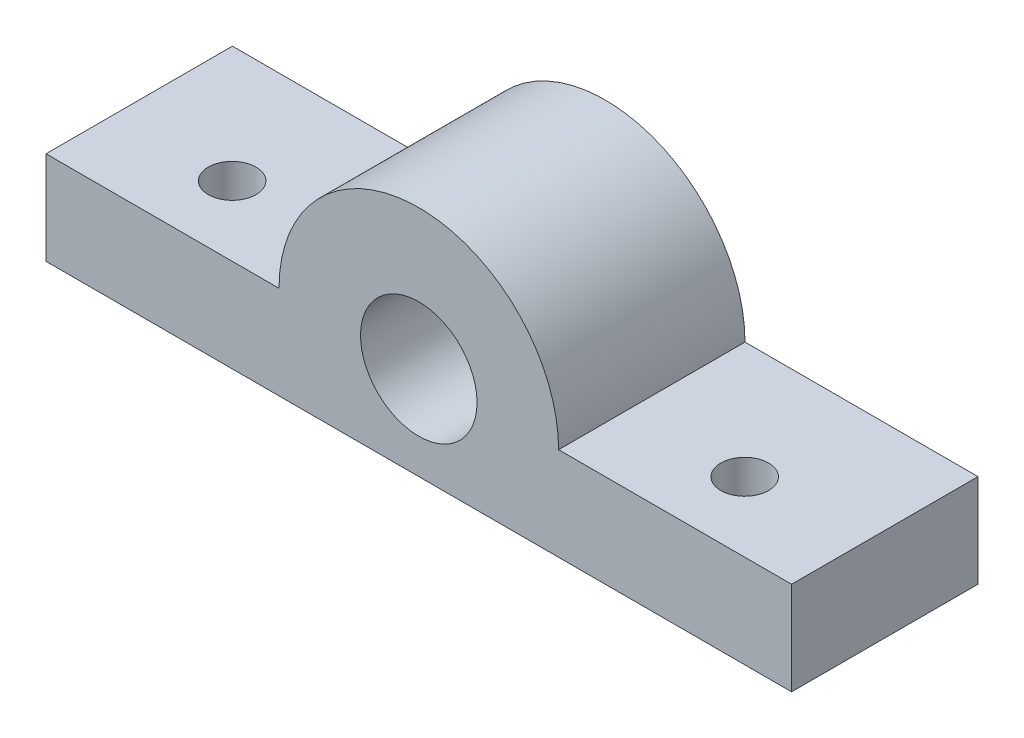
ISO-10303-21;
HEADER;
FILE_DESCRIPTION(('STEP AP214'),'2;1');
FILE_NAME('part.step','',(''),(''),'','','');
FILE_SCHEMA(('AUTOMOTIVE_DESIGN { 1 0 10303 214 1 1 1 1 }'));
ENDSEC;
DATA;
#1=APPLICATION_CONTEXT('core data for automotive mechanical design processes');
#2=APPLICATION_PROTOCOL_DEFINITION('international standard','automotive_design',2000,#1);
#3=PRODUCT_CONTEXT('',#1,'mechanical');
#4=PRODUCT('Part','Part','',(#3));
#5=PRODUCT_RELATED_PRODUCT_CATEGORY('part','',(#4));
#6=PRODUCT_DEFINITION_FORMATION('','',#4);
#7=PRODUCT_DEFINITION_CONTEXT('part definition',#1,'design');
#8=PRODUCT_DEFINITION('design','',#6,#7);
#9=PRODUCT_DEFINITION_SHAPE('','',#8);
#10=(LENGTH_UNIT() NAMED_UNIT(*) SI_UNIT(.MILLI.,.METRE.));
#11=(NAMED_UNIT(*) PLANE_ANGLE_UNIT() SI_UNIT($,.RADIAN.));
#12=(NAMED_UNIT(*) SI_UNIT($,.STERADIAN.) SOLID_ANGLE_UNIT());
#13=UNCERTAINTY_MEASURE_WITH_UNIT(LENGTH_MEASURE(1.E-05),#10,'distance_accuracy_value','');
#14=(GEOMETRIC_REPRESENTATION_CONTEXT(3) GLOBAL_UNCERTAINTY_ASSIGNED_CONTEXT((#13)) GLOBAL_UNIT_ASSIGNED_CONTEXT((#10,
#11,#12)) REPRESENTATION_CONTEXT('',''));
#15=CARTESIAN_POINT('',(0.,0.,0.));
#16=DIRECTION('',(0.,0.,1.));
#17=DIRECTION('',(1.,0.,0.));
#18=AXIS2_PLACEMENT_3D('',#15,#16,#17);
#19=CARTESIAN_POINT('',(-35.941646909646,4.,8.));
#20=DIRECTION('',(0.,0.,-1.));
#21=DIRECTION('',(-1.,0.,0.));
#22=AXIS2_PLACEMENT_3D('',#19,#20,#21);
#23=PLANE('',#22);
#24=DIRECTION('',(0.,-1.,0.));
#25=VECTOR('',#24,1.);
#26=CARTESIAN_POINT('',(-51.941646909646,0.,8.));
#27=LINE('',#26,#25);
#28=CARTESIAN_POINT('',(-51.941646909646,4.,8.));
#29=VERTEX_POINT('',#28);
#30=CARTESIAN_POINT('',(-51.941646909646,0.,8.));
#31=VERTEX_POINT('',#30);
#32=EDGE_CURVE('E130',#29,#31,#27,.T.);
#33=ORIENTED_EDGE('',*,*,#32,.T.);
#34=DIRECTION('',(1.,0.,0.));
#35=VECTOR('',#34,1.);
#36=CARTESIAN_POINT('',(-51.941646909646,0.,8.));
#37=LINE('',#36,#35);
#38=CARTESIAN_POINT('',(-19.941646909646,0.,8.));
#39=VERTEX_POINT('',#38);
#40=EDGE_CURVE('E88',#31,#39,#37,.T.);
#41=ORIENTED_EDGE('',*,*,#40,.T.);
#42=DIRECTION('',(0.,1.,0.));
#43=VECTOR('',#42,1.);
#44=CARTESIAN_POINT('',(-19.941646909646,0.,8.));
#45=LINE('',#44,#43);
#46=CARTESIAN_POINT('',(-19.941646909646,4.,8.));
#47=VERTEX_POINT('',#46);
#48=EDGE_CURVE('E101',#39,#47,#45,.T.);
#49=ORIENTED_EDGE('',*,*,#48,.T.);
#50=DIRECTION('',(-1.,0.,0.));
#51=VECTOR('',#50,1.);
#52=CARTESIAN_POINT('',(-19.941646909646,4.,8.));
#53=LINE('',#52,#51);
#54=CARTESIAN_POINT('',(-29.941646909646,4.,8.));
#55=VERTEX_POINT('',#54);
#56=EDGE_CURVE('E95',#47,#55,#53,.T.);
#57=ORIENTED_EDGE('',*,*,#56,.T.);
#58=CARTESIAN_POINT('',(-35.941646909646,4.,8.));
#59=DIRECTION('',(0.,0.,1.));
#60=DIRECTION('',(-1.,0.,0.));
#61=AXIS2_PLACEMENT_3D('',#58,#59,#60);
#62=CIRCLE('',#61,6.);
#63=CARTESIAN_POINT('',(-41.941646909646,4.,8.));
#64=VERTEX_POINT('',#63);
#65=EDGE_CURVE('E99',#55,#64,#62,.T.);
#66=ORIENTED_EDGE('',*,*,#65,.T.);
#67=DIRECTION('',(-1.,0.,0.));
#68=VECTOR('',#67,1.);
#69=CARTESIAN_POINT('',(-51.941646909646,4.,8.));
#70=LINE('',#69,#68);
#71=EDGE_CURVE('E51',#64,#29,#70,.T.);
#72=ORIENTED_EDGE('',*,*,#71,.T.);
#73=EDGE_LOOP('',(#33,#41,#49,#57,#66,#72));
#74=FACE_BOUND('',#73,.T.);
#75=CARTESIAN_POINT('',(-35.941646909646,4.,8.));
#76=DIRECTION('',(0.,0.,1.));
#77=DIRECTION('',(1.,0.,0.));
#78=AXIS2_PLACEMENT_3D('',#75,#76,#77);
#79=CIRCLE('',#78,2.5);
#80=CARTESIAN_POINT('',(-33.441646909646,4.,8.));
#81=VERTEX_POINT('',#80);
#82=EDGE_CURVE('E123',#81,#81,#79,.T.);
#83=ORIENTED_EDGE('',*,*,#82,.F.);
#84=EDGE_LOOP('',(#83));
#85=FACE_BOUND('',#84,.T.);
#86=ADVANCED_FACE('F34',(#74,#85),#23,.F.);
#87=CARTESIAN_POINT('',(-35.941646909646,4.,0.));
#88=DIRECTION('',(0.,0.,-1.));
#89=DIRECTION('',(-1.,0.,0.));
#90=AXIS2_PLACEMENT_3D('',#87,#88,#89);
#91=PLANE('',#90);
#92=DIRECTION('',(0.,-1.,0.));
#93=VECTOR('',#92,1.);
#94=CARTESIAN_POINT('',(-51.941646909646,0.,0.));
#95=LINE('',#94,#93);
#96=CARTESIAN_POINT('',(-51.941646909646,4.,0.));
#97=VERTEX_POINT('',#96);
#98=CARTESIAN_POINT('',(-51.941646909646,0.,0.));
#99=VERTEX_POINT('',#98);
#100=EDGE_CURVE('E119',#97,#99,#95,.T.);
#101=ORIENTED_EDGE('',*,*,#100,.F.);
#102=DIRECTION('',(-1.,0.,0.));
#103=VECTOR('',#102,1.);
#104=CARTESIAN_POINT('',(-51.941646909646,4.,0.));
#105=LINE('',#104,#103);
#106=CARTESIAN_POINT('',(-41.941646909646,4.,0.));
#107=VERTEX_POINT('',#106);
#108=EDGE_CURVE('E80',#107,#97,#105,.T.);
#109=ORIENTED_EDGE('',*,*,#108,.F.);
#110=CARTESIAN_POINT('',(-35.941646909646,4.,0.));
#111=DIRECTION('',(0.,0.,1.));
#112=DIRECTION('',(-1.,0.,0.));
#113=AXIS2_PLACEMENT_3D('',#110,#111,#112);
#114=CIRCLE('',#113,6.);
#115=CARTESIAN_POINT('',(-29.941646909646,4.,0.));
#116=VERTEX_POINT('',#115);
#117=EDGE_CURVE('E74',#116,#107,#114,.T.);
#118=ORIENTED_EDGE('',*,*,#117,.F.);
#119=DIRECTION('',(-1.,0.,0.));
#120=VECTOR('',#119,1.);
#121=CARTESIAN_POINT('',(-19.941646909646,4.,0.));
#122=LINE('',#121,#120);
#123=CARTESIAN_POINT('',(-19.941646909646,4.,0.));
#124=VERTEX_POINT('',#123);
#125=EDGE_CURVE('E109',#124,#116,#122,.T.);
#126=ORIENTED_EDGE('',*,*,#125,.F.);
#127=DIRECTION('',(0.,1.,0.));
#128=VECTOR('',#127,1.);
#129=CARTESIAN_POINT('',(-19.941646909646,0.,0.));
#130=LINE('',#129,#128);
#131=CARTESIAN_POINT('',(-19.941646909646,0.,0.));
#132=VERTEX_POINT('',#131);
#133=EDGE_CURVE('E125',#132,#124,#130,.T.);
#134=ORIENTED_EDGE('',*,*,#133,.F.);
#135=DIRECTION('',(1.,0.,0.));
#136=VECTOR('',#135,1.);
#137=CARTESIAN_POINT('',(-51.941646909646,0.,0.));
#138=LINE('',#137,#136);
#139=EDGE_CURVE('E122',#99,#132,#138,.T.);
#140=ORIENTED_EDGE('',*,*,#139,.F.);
#141=EDGE_LOOP('',(#101,#109,#118,#126,#134,#140));
#142=FACE_BOUND('',#141,.T.);
#143=CARTESIAN_POINT('',(-35.941646909646,4.,0.));
#144=DIRECTION('',(0.,0.,1.));
#145=DIRECTION('',(1.,0.,0.));
#146=AXIS2_PLACEMENT_3D('',#143,#144,#145);
#147=CIRCLE('',#146,2.5);
#148=CARTESIAN_POINT('',(-33.441646909646,4.,0.));
#149=VERTEX_POINT('',#148);
#150=EDGE_CURVE('E189',#149,#149,#147,.T.);
#151=ORIENTED_EDGE('',*,*,#150,.T.);
#152=EDGE_LOOP('',(#151));
#153=FACE_BOUND('',#152,.T.);
#154=ADVANCED_FACE('F139',(#142,#153),#91,.T.);
#155=CARTESIAN_POINT('',(-51.941646909646,0.,8.));
#156=DIRECTION('',(1.,0.,0.));
#157=DIRECTION('',(0.,0.,-1.));
#158=AXIS2_PLACEMENT_3D('',#155,#156,#157);
#159=PLANE('',#158);
#160=ORIENTED_EDGE('',*,*,#100,.T.);
#161=DIRECTION('',(0.,0.,-1.));
#162=VECTOR('',#161,1.);
#163=CARTESIAN_POINT('',(-51.941646909646,0.,8.));
#164=LINE('',#163,#162);
#165=EDGE_CURVE('E11',#31,#99,#164,.T.);
#166=ORIENTED_EDGE('',*,*,#165,.F.);
#167=ORIENTED_EDGE('',*,*,#32,.F.);
#168=DIRECTION('',(0.,0.,-1.));
#169=VECTOR('',#168,1.);
#170=CARTESIAN_POINT('',(-51.941646909646,4.,8.));
#171=LINE('',#170,#169);
#172=EDGE_CURVE('E115',#29,#97,#171,.T.);
#173=ORIENTED_EDGE('',*,*,#172,.T.);
#174=EDGE_LOOP('',(#160,#166,#167,#173));
#175=FACE_BOUND('',#174,.T.);
#176=ADVANCED_FACE('F36',(#175),#159,.F.);
#177=CARTESIAN_POINT('',(-51.941646909646,0.,8.));
#178=DIRECTION('',(0.,1.,0.));
#179=DIRECTION('',(-1.,0.,0.));
#180=AXIS2_PLACEMENT_3D('',#177,#178,#179);
#181=PLANE('',#180);
#182=CARTESIAN_POINT('',(-46.9401047617097,0.,5.01255284854096));
#183=DIRECTION('',(0.,1.,0.));
#184=DIRECTION('',(-1.,0.,0.));
#185=AXIS2_PLACEMENT_3D('',#182,#183,#184);
#186=CIRCLE('',#185,1.025);
#187=CARTESIAN_POINT('',(-47.9651047617097,0.,5.01255284854096));
#188=VERTEX_POINT('',#187);
#189=EDGE_CURVE('E178',#188,#188,#186,.T.);
#190=ORIENTED_EDGE('',*,*,#189,.T.);
#191=EDGE_LOOP('',(#190));
#192=FACE_BOUND('',#191,.T.);
#193=CARTESIAN_POINT('',(-24.9415176032137,0.,5.01255284854096));
#194=DIRECTION('',(0.,1.,0.));
#195=DIRECTION('',(-1.,0.,0.));
#196=AXIS2_PLACEMENT_3D('',#193,#194,#195);
#197=CIRCLE('',#196,1.025);
#198=CARTESIAN_POINT('',(-25.9665176032137,0.,5.01255284854096));
#199=VERTEX_POINT('',#198);
#200=EDGE_CURVE('E183',#199,#199,#197,.T.);
#201=ORIENTED_EDGE('',*,*,#200,.T.);
#202=EDGE_LOOP('',(#201));
#203=FACE_BOUND('',#202,.T.);
#204=ORIENTED_EDGE('',*,*,#139,.T.);
#205=DIRECTION('',(0.,0.,-1.));
#206=VECTOR('',#205,1.);
#207=CARTESIAN_POINT('',(-19.941646909646,0.,8.));
#208=LINE('',#207,#206);
#209=EDGE_CURVE('E43',#39,#132,#208,.T.);
#210=ORIENTED_EDGE('',*,*,#209,.F.);
#211=ORIENTED_EDGE('',*,*,#40,.F.);
#212=ORIENTED_EDGE('',*,*,#165,.T.);
#213=EDGE_LOOP('',(#204,#210,#211,#212));
#214=FACE_BOUND('',#213,.T.);
#215=ADVANCED_FACE('F200',(#192,#203,#214),#181,.F.);
#216=CARTESIAN_POINT('',(-19.941646909646,0.,8.));
#217=DIRECTION('',(-1.,0.,0.));
#218=DIRECTION('',(0.,0.,1.));
#219=AXIS2_PLACEMENT_3D('',#216,#217,#218);
#220=PLANE('',#219);
#221=ORIENTED_EDGE('',*,*,#133,.T.);
#222=DIRECTION('',(0.,0.,-1.));
#223=VECTOR('',#222,1.);
#224=CARTESIAN_POINT('',(-19.941646909646,4.,8.));
#225=LINE('',#224,#223);
#226=EDGE_CURVE('E110',#47,#124,#225,.T.);
#227=ORIENTED_EDGE('',*,*,#226,.F.);
#228=ORIENTED_EDGE('',*,*,#48,.F.);
#229=ORIENTED_EDGE('',*,*,#209,.T.);
#230=EDGE_LOOP('',(#221,#227,#228,#229));
#231=FACE_BOUND('',#230,.T.);
#232=ADVANCED_FACE('F136',(#231),#220,.F.);
#233=CARTESIAN_POINT('',(-19.941646909646,4.,8.));
#234=DIRECTION('',(0.,-1.,0.));
#235=DIRECTION('',(1.,0.,0.));
#236=AXIS2_PLACEMENT_3D('',#233,#234,#235);
#237=PLANE('',#236);
#238=CARTESIAN_POINT('',(-24.9415176032137,4.,5.01255284854096));
#239=DIRECTION('',(0.,1.,0.));
#240=DIRECTION('',(0.,0.,1.));
#241=AXIS2_PLACEMENT_3D('',#238,#239,#240);
#242=CIRCLE('',#241,1.025);
#243=CARTESIAN_POINT('',(-24.9415176032137,4.,6.03755284854096));
#244=VERTEX_POINT('',#243);
#245=EDGE_CURVE('E180',#244,#244,#242,.T.);
#246=ORIENTED_EDGE('',*,*,#245,.F.);
#247=EDGE_LOOP('',(#246));
#248=FACE_BOUND('',#247,.T.);
#249=ORIENTED_EDGE('',*,*,#125,.T.);
#250=DIRECTION('',(0.,0.,-1.));
#251=VECTOR('',#250,1.);
#252=CARTESIAN_POINT('',(-29.941646909646,4.,8.));
#253=LINE('',#252,#251);
#254=EDGE_CURVE('E106',#55,#116,#253,.T.);
#255=ORIENTED_EDGE('',*,*,#254,.F.);
#256=ORIENTED_EDGE('',*,*,#56,.F.);
#257=ORIENTED_EDGE('',*,*,#226,.T.);
#258=EDGE_LOOP('',(#249,#255,#256,#257));
#259=FACE_BOUND('',#258,.T.);
#260=ADVANCED_FACE('F107',(#248,#259),#237,.F.);
#261=CARTESIAN_POINT('',(-35.941646909646,4.,8.));
#262=DIRECTION('',(0.,0.,-1.));
#263=DIRECTION('',(-1.,0.,0.));
#264=AXIS2_PLACEMENT_3D('',#261,#262,#263);
#265=CYLINDRICAL_SURFACE('',#264,6.);
#266=ORIENTED_EDGE('',*,*,#117,.T.);
#267=DIRECTION('',(0.,0.,-1.));
#268=VECTOR('',#267,1.);
#269=CARTESIAN_POINT('',(-41.941646909646,4.,8.));
#270=LINE('',#269,#268);
#271=EDGE_CURVE('E111',#64,#107,#270,.T.);
#272=ORIENTED_EDGE('',*,*,#271,.F.);
#273=ORIENTED_EDGE('',*,*,#65,.F.);
#274=ORIENTED_EDGE('',*,*,#254,.T.);
#275=EDGE_LOOP('',(#266,#272,#273,#274));
#276=FACE_BOUND('',#275,.T.);
#277=ADVANCED_FACE('F113',(#276),#265,.T.);
#278=CARTESIAN_POINT('',(-51.941646909646,4.,8.));
#279=DIRECTION('',(0.,-1.,0.));
#280=DIRECTION('',(1.,0.,0.));
#281=AXIS2_PLACEMENT_3D('',#278,#279,#280);
#282=PLANE('',#281);
#283=CARTESIAN_POINT('',(-46.9401047617097,4.,5.01255284854096));
#284=DIRECTION('',(0.,1.,0.));
#285=DIRECTION('',(0.,0.,1.));
#286=AXIS2_PLACEMENT_3D('',#283,#284,#285);
#287=CIRCLE('',#286,1.025);
#288=CARTESIAN_POINT('',(-46.9401047617097,4.,6.03755284854096));
#289=VERTEX_POINT('',#288);
#290=EDGE_CURVE('E175',#289,#289,#287,.T.);
#291=ORIENTED_EDGE('',*,*,#290,.F.);
#292=EDGE_LOOP('',(#291));
#293=FACE_BOUND('',#292,.T.);
#294=ORIENTED_EDGE('',*,*,#108,.T.);
#295=ORIENTED_EDGE('',*,*,#172,.F.);
#296=ORIENTED_EDGE('',*,*,#71,.F.);
#297=ORIENTED_EDGE('',*,*,#271,.T.);
#298=EDGE_LOOP('',(#294,#295,#296,#297));
#299=FACE_BOUND('',#298,.T.);
#300=ADVANCED_FACE('F144',(#293,#299),#282,.F.);
#301=CARTESIAN_POINT('',(-35.941646909646,4.,8.));
#302=DIRECTION('',(0.,0.,-1.));
#303=DIRECTION('',(-1.,0.,0.));
#304=AXIS2_PLACEMENT_3D('',#301,#302,#303);
#305=CYLINDRICAL_SURFACE('',#304,2.5);
#306=ORIENTED_EDGE('',*,*,#82,.T.);
#307=EDGE_LOOP('',(#306));
#308=FACE_BOUND('',#307,.T.);
#309=ORIENTED_EDGE('',*,*,#150,.F.);
#310=EDGE_LOOP('',(#309));
#311=FACE_BOUND('',#310,.T.);
#312=ADVANCED_FACE('F146',(#308,#311),#305,.F.);
#313=CARTESIAN_POINT('',(-24.9415176032137,4.,5.01255284854096));
#314=DIRECTION('',(0.,1.,0.));
#315=DIRECTION('',(0.,0.,1.));
#316=AXIS2_PLACEMENT_3D('',#313,#314,#315);
#317=CYLINDRICAL_SURFACE('',#316,1.025);
#318=ORIENTED_EDGE('',*,*,#245,.T.);
#319=EDGE_LOOP('',(#318));
#320=FACE_BOUND('',#319,.T.);
#321=ORIENTED_EDGE('',*,*,#200,.F.);
#322=EDGE_LOOP('',(#321));
#323=FACE_BOUND('',#322,.T.);
#324=ADVANCED_FACE('F153',(#320,#323),#317,.F.);
#325=CARTESIAN_POINT('',(-46.9401047617097,4.,5.01255284854096));
#326=DIRECTION('',(0.,1.,0.));
#327=DIRECTION('',(0.,0.,1.));
#328=AXIS2_PLACEMENT_3D('',#325,#326,#327);
#329=CYLINDRICAL_SURFACE('',#328,1.025);
#330=ORIENTED_EDGE('',*,*,#290,.T.);
#331=EDGE_LOOP('',(#330));
#332=FACE_BOUND('',#331,.T.);
#333=ORIENTED_EDGE('',*,*,#189,.F.);
#334=EDGE_LOOP('',(#333));
#335=FACE_BOUND('',#334,.T.);
#336=ADVANCED_FACE('F167',(#332,#335),#329,.F.);
#337=CLOSED_SHELL('',(#86,#154,#176,#215,#232,#260,#277,#300,#312,#324,#336));
#338=MANIFOLD_SOLID_BREP('B2',#337);
#339=ADVANCED_BREP_SHAPE_REPRESENTATION('',(#18,#338),#14);
#340=SHAPE_DEFINITION_REPRESENTATION(#9,#339);
ENDSEC;
END-ISO-10303-21;
